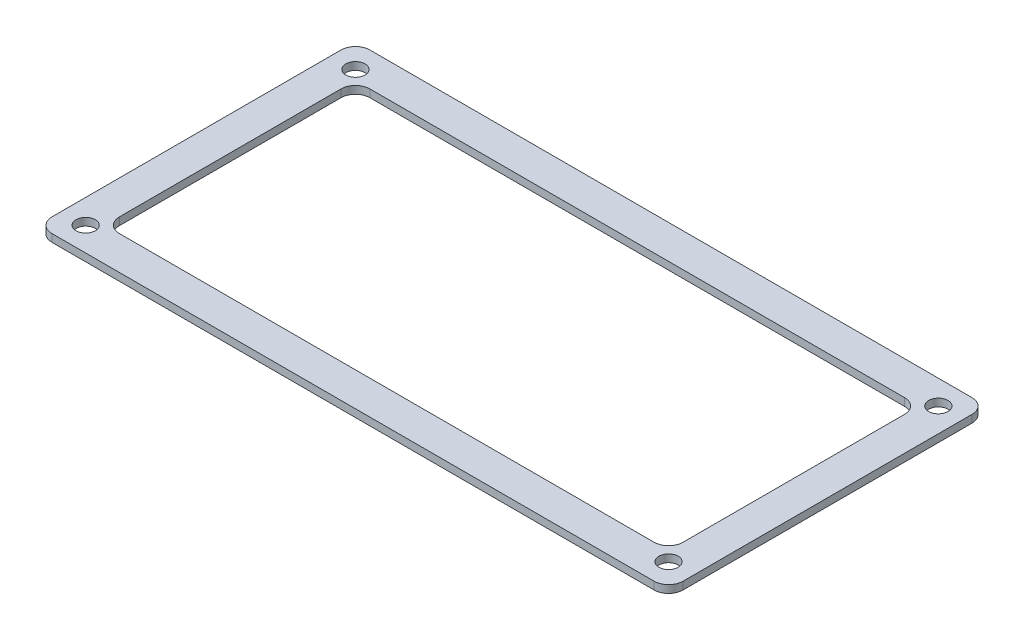
ISO-10303-21;
HEADER;
FILE_DESCRIPTION(('STEP AP214'),'2;1');
FILE_NAME('part.step','',(''),(''),'','','');
FILE_SCHEMA(('AUTOMOTIVE_DESIGN { 1 0 10303 214 1 1 1 1 }'));
ENDSEC;
DATA;
#1=APPLICATION_CONTEXT('core data for automotive mechanical design processes');
#2=APPLICATION_PROTOCOL_DEFINITION('international standard','automotive_design',2000,#1);
#3=PRODUCT_CONTEXT('',#1,'mechanical');
#4=PRODUCT('Part','Part','',(#3));
#5=PRODUCT_RELATED_PRODUCT_CATEGORY('part','',(#4));
#6=PRODUCT_DEFINITION_FORMATION('','',#4);
#7=PRODUCT_DEFINITION_CONTEXT('part definition',#1,'design');
#8=PRODUCT_DEFINITION('design','',#6,#7);
#9=PRODUCT_DEFINITION_SHAPE('','',#8);
#10=(LENGTH_UNIT() NAMED_UNIT(*) SI_UNIT(.MILLI.,.METRE.));
#11=(NAMED_UNIT(*) PLANE_ANGLE_UNIT() SI_UNIT($,.RADIAN.));
#12=(NAMED_UNIT(*) SI_UNIT($,.STERADIAN.) SOLID_ANGLE_UNIT());
#13=UNCERTAINTY_MEASURE_WITH_UNIT(LENGTH_MEASURE(1.E-05),#10,'distance_accuracy_value','');
#14=(GEOMETRIC_REPRESENTATION_CONTEXT(3) GLOBAL_UNCERTAINTY_ASSIGNED_CONTEXT((#13)) GLOBAL_UNIT_ASSIGNED_CONTEXT((#10,
#11,#12)) REPRESENTATION_CONTEXT('',''));
#15=CARTESIAN_POINT('',(0.,0.,0.));
#16=DIRECTION('',(0.,0.,1.));
#17=DIRECTION('',(1.,0.,0.));
#18=AXIS2_PLACEMENT_3D('',#15,#16,#17);
#19=CARTESIAN_POINT('',(-65.5,1.5875,-33.));
#20=DIRECTION('',(1.,0.,0.));
#21=DIRECTION('',(0.,0.,-1.));
#22=AXIS2_PLACEMENT_3D('',#19,#20,#21);
#23=PLANE('',#22);
#24=DIRECTION('',(0.,0.,1.));
#25=VECTOR('',#24,1.);
#26=CARTESIAN_POINT('',(-65.5,1.5875,-33.));
#27=LINE('',#26,#25);
#28=CARTESIAN_POINT('',(-65.5,1.5875,-30.));
#29=VERTEX_POINT('',#28);
#30=CARTESIAN_POINT('',(-65.5,1.5875,30.));
#31=VERTEX_POINT('',#30);
#32=EDGE_CURVE('E197',#29,#31,#27,.T.);
#33=ORIENTED_EDGE('',*,*,#32,.F.);
#34=DIRECTION('',(0.,-1.,0.));
#35=VECTOR('',#34,1.);
#36=CARTESIAN_POINT('',(-65.5,1.5875,-30.));
#37=LINE('',#36,#35);
#38=CARTESIAN_POINT('',(-65.5,0.,-30.));
#39=VERTEX_POINT('',#38);
#40=EDGE_CURVE('E166',#29,#39,#37,.T.);
#41=ORIENTED_EDGE('',*,*,#40,.T.);
#42=DIRECTION('',(0.,0.,1.));
#43=VECTOR('',#42,1.);
#44=CARTESIAN_POINT('',(-65.5,0.,-33.));
#45=LINE('',#44,#43);
#46=CARTESIAN_POINT('',(-65.5,0.,30.));
#47=VERTEX_POINT('',#46);
#48=EDGE_CURVE('E212',#39,#47,#45,.T.);
#49=ORIENTED_EDGE('',*,*,#48,.T.);
#50=DIRECTION('',(0.,-1.,0.));
#51=VECTOR('',#50,1.);
#52=CARTESIAN_POINT('',(-65.5,1.5875,30.));
#53=LINE('',#52,#51);
#54=EDGE_CURVE('E291',#47,#31,#53,.F.);
#55=ORIENTED_EDGE('',*,*,#54,.T.);
#56=EDGE_LOOP('',(#33,#41,#49,#55));
#57=FACE_BOUND('',#56,.T.);
#58=ADVANCED_FACE('F39',(#57),#23,.F.);
#59=CARTESIAN_POINT('',(-65.5,1.5875,33.));
#60=DIRECTION('',(0.,0.,-1.));
#61=DIRECTION('',(-1.,0.,0.));
#62=AXIS2_PLACEMENT_3D('',#59,#60,#61);
#63=PLANE('',#62);
#64=DIRECTION('',(1.,0.,0.));
#65=VECTOR('',#64,1.);
#66=CARTESIAN_POINT('',(-65.5,0.,33.));
#67=LINE('',#66,#65);
#68=CARTESIAN_POINT('',(-62.5,0.,33.));
#69=VERTEX_POINT('',#68);
#70=CARTESIAN_POINT('',(62.5,0.,33.));
#71=VERTEX_POINT('',#70);
#72=EDGE_CURVE('E216',#69,#71,#67,.T.);
#73=ORIENTED_EDGE('',*,*,#72,.T.);
#74=DIRECTION('',(0.,-1.,0.));
#75=VECTOR('',#74,1.);
#76=CARTESIAN_POINT('',(62.5,1.5875,33.));
#77=LINE('',#76,#75);
#78=CARTESIAN_POINT('',(62.5,1.5875,33.));
#79=VERTEX_POINT('',#78);
#80=EDGE_CURVE('E271',#71,#79,#77,.F.);
#81=ORIENTED_EDGE('',*,*,#80,.T.);
#82=DIRECTION('',(1.,0.,0.));
#83=VECTOR('',#82,1.);
#84=CARTESIAN_POINT('',(-65.5,1.5875,33.));
#85=LINE('',#84,#83);
#86=CARTESIAN_POINT('',(-62.5,1.5875,33.));
#87=VERTEX_POINT('',#86);
#88=EDGE_CURVE('E201',#87,#79,#85,.T.);
#89=ORIENTED_EDGE('',*,*,#88,.F.);
#90=DIRECTION('',(0.,-1.,0.));
#91=VECTOR('',#90,1.);
#92=CARTESIAN_POINT('',(-62.5,1.5875,33.));
#93=LINE('',#92,#91);
#94=EDGE_CURVE('E267',#87,#69,#93,.T.);
#95=ORIENTED_EDGE('',*,*,#94,.T.);
#96=EDGE_LOOP('',(#73,#81,#89,#95));
#97=FACE_BOUND('',#96,.T.);
#98=ADVANCED_FACE('F405',(#97),#63,.F.);
#99=CARTESIAN_POINT('',(65.5,1.5875,-33.));
#100=DIRECTION('',(-1.,0.,0.));
#101=DIRECTION('',(0.,0.,1.));
#102=AXIS2_PLACEMENT_3D('',#99,#100,#101);
#103=PLANE('',#102);
#104=DIRECTION('',(0.,0.,-1.));
#105=VECTOR('',#104,1.);
#106=CARTESIAN_POINT('',(65.5,1.5875,-33.));
#107=LINE('',#106,#105);
#108=CARTESIAN_POINT('',(65.5,1.5875,30.));
#109=VERTEX_POINT('',#108);
#110=CARTESIAN_POINT('',(65.5,1.5875,-30.));
#111=VERTEX_POINT('',#110);
#112=EDGE_CURVE('E206',#109,#111,#107,.T.);
#113=ORIENTED_EDGE('',*,*,#112,.F.);
#114=DIRECTION('',(0.,-1.,0.));
#115=VECTOR('',#114,1.);
#116=CARTESIAN_POINT('',(65.5,1.5875,30.));
#117=LINE('',#116,#115);
#118=CARTESIAN_POINT('',(65.5,0.,30.));
#119=VERTEX_POINT('',#118);
#120=EDGE_CURVE('E251',#109,#119,#117,.T.);
#121=ORIENTED_EDGE('',*,*,#120,.T.);
#122=DIRECTION('',(0.,0.,-1.));
#123=VECTOR('',#122,1.);
#124=CARTESIAN_POINT('',(65.5,0.,-33.));
#125=LINE('',#124,#123);
#126=CARTESIAN_POINT('',(65.5,0.,-30.));
#127=VERTEX_POINT('',#126);
#128=EDGE_CURVE('E221',#119,#127,#125,.T.);
#129=ORIENTED_EDGE('',*,*,#128,.T.);
#130=DIRECTION('',(0.,-1.,0.));
#131=VECTOR('',#130,1.);
#132=CARTESIAN_POINT('',(65.5,1.5875,-30.));
#133=LINE('',#132,#131);
#134=EDGE_CURVE('E248',#127,#111,#133,.F.);
#135=ORIENTED_EDGE('',*,*,#134,.T.);
#136=EDGE_LOOP('',(#113,#121,#129,#135));
#137=FACE_BOUND('',#136,.T.);
#138=ADVANCED_FACE('F411',(#137),#103,.F.);
#139=CARTESIAN_POINT('',(-65.5,1.5875,-33.));
#140=DIRECTION('',(0.,0.,1.));
#141=DIRECTION('',(1.,0.,0.));
#142=AXIS2_PLACEMENT_3D('',#139,#140,#141);
#143=PLANE('',#142);
#144=DIRECTION('',(-1.,0.,0.));
#145=VECTOR('',#144,1.);
#146=CARTESIAN_POINT('',(-65.5,1.5875,-33.));
#147=LINE('',#146,#145);
#148=CARTESIAN_POINT('',(62.5,1.5875,-33.));
#149=VERTEX_POINT('',#148);
#150=CARTESIAN_POINT('',(-62.5,1.5875,-33.));
#151=VERTEX_POINT('',#150);
#152=EDGE_CURVE('E209',#149,#151,#147,.T.);
#153=ORIENTED_EDGE('',*,*,#152,.F.);
#154=DIRECTION('',(0.,-1.,0.));
#155=VECTOR('',#154,1.);
#156=CARTESIAN_POINT('',(62.5,1.5875,-33.));
#157=LINE('',#156,#155);
#158=CARTESIAN_POINT('',(62.5,0.,-33.));
#159=VERTEX_POINT('',#158);
#160=EDGE_CURVE('E287',#149,#159,#157,.T.);
#161=ORIENTED_EDGE('',*,*,#160,.T.);
#162=DIRECTION('',(-1.,0.,0.));
#163=VECTOR('',#162,1.);
#164=CARTESIAN_POINT('',(-65.5,0.,-33.));
#165=LINE('',#164,#163);
#166=CARTESIAN_POINT('',(-62.5,0.,-33.));
#167=VERTEX_POINT('',#166);
#168=EDGE_CURVE('E202',#159,#167,#165,.T.);
#169=ORIENTED_EDGE('',*,*,#168,.T.);
#170=DIRECTION('',(0.,-1.,0.));
#171=VECTOR('',#170,1.);
#172=CARTESIAN_POINT('',(-62.5,1.5875,-33.));
#173=LINE('',#172,#171);
#174=EDGE_CURVE('E55',#167,#151,#173,.F.);
#175=ORIENTED_EDGE('',*,*,#174,.T.);
#176=EDGE_LOOP('',(#153,#161,#169,#175));
#177=FACE_BOUND('',#176,.T.);
#178=ADVANCED_FACE('F388',(#177),#143,.F.);
#179=CARTESIAN_POINT('',(0.,1.5875,0.));
#180=DIRECTION('',(0.,1.,0.));
#181=DIRECTION('',(0.,0.,1.));
#182=AXIS2_PLACEMENT_3D('',#179,#180,#181);
#183=PLANE('',#182);
#184=CARTESIAN_POINT('',(-60.5,1.5875,28.));
#185=DIRECTION('',(0.,1.,0.));
#186=DIRECTION('',(0.,0.,1.));
#187=AXIS2_PLACEMENT_3D('',#184,#185,#186);
#188=CIRCLE('',#187,2.);
#189=CARTESIAN_POINT('',(-60.5,1.5875,30.));
#190=VERTEX_POINT('',#189);
#191=EDGE_CURVE('E353',#190,#190,#188,.T.);
#192=ORIENTED_EDGE('',*,*,#191,.F.);
#193=EDGE_LOOP('',(#192));
#194=FACE_BOUND('',#193,.T.);
#195=CARTESIAN_POINT('',(60.5,1.5875,28.));
#196=DIRECTION('',(0.,1.,0.));
#197=DIRECTION('',(0.,0.,1.));
#198=AXIS2_PLACEMENT_3D('',#195,#196,#197);
#199=CIRCLE('',#198,2.);
#200=CARTESIAN_POINT('',(60.5,1.5875,30.));
#201=VERTEX_POINT('',#200);
#202=EDGE_CURVE('E361',#201,#201,#199,.T.);
#203=ORIENTED_EDGE('',*,*,#202,.F.);
#204=EDGE_LOOP('',(#203));
#205=FACE_BOUND('',#204,.T.);
#206=CARTESIAN_POINT('',(60.5,1.5875,-28.));
#207=DIRECTION('',(0.,1.,0.));
#208=DIRECTION('',(0.,0.,1.));
#209=AXIS2_PLACEMENT_3D('',#206,#207,#208);
#210=CIRCLE('',#209,2.);
#211=CARTESIAN_POINT('',(60.5,1.5875,-26.));
#212=VERTEX_POINT('',#211);
#213=EDGE_CURVE('E369',#212,#212,#210,.T.);
#214=ORIENTED_EDGE('',*,*,#213,.F.);
#215=EDGE_LOOP('',(#214));
#216=FACE_BOUND('',#215,.T.);
#217=CARTESIAN_POINT('',(-60.5,1.5875,-28.));
#218=DIRECTION('',(0.,1.,0.));
#219=DIRECTION('',(0.,0.,1.));
#220=AXIS2_PLACEMENT_3D('',#217,#218,#219);
#221=CIRCLE('',#220,2.);
#222=CARTESIAN_POINT('',(-60.5,1.5875,-26.));
#223=VERTEX_POINT('',#222);
#224=EDGE_CURVE('E337',#223,#223,#221,.T.);
#225=ORIENTED_EDGE('',*,*,#224,.F.);
#226=EDGE_LOOP('',(#225));
#227=FACE_BOUND('',#226,.T.);
#228=DIRECTION('',(0.,0.,1.));
#229=VECTOR('',#228,1.);
#230=CARTESIAN_POINT('',(-58.5,1.5875,26.));
#231=LINE('',#230,#229);
#232=CARTESIAN_POINT('',(-58.5,1.5875,-23.));
#233=VERTEX_POINT('',#232);
#234=CARTESIAN_POINT('',(-58.5,1.5875,23.));
#235=VERTEX_POINT('',#234);
#236=EDGE_CURVE('E193',#233,#235,#231,.T.);
#237=ORIENTED_EDGE('',*,*,#236,.F.);
#238=CARTESIAN_POINT('',(-55.5,1.5875,-23.));
#239=DIRECTION('',(0.,1.,0.));
#240=DIRECTION('',(0.,0.,1.));
#241=AXIS2_PLACEMENT_3D('',#238,#239,#240);
#242=CIRCLE('',#241,3.);
#243=CARTESIAN_POINT('',(-55.5,1.5875,-26.));
#244=VERTEX_POINT('',#243);
#245=EDGE_CURVE('E48',#233,#244,#242,.F.);
#246=ORIENTED_EDGE('',*,*,#245,.T.);
#247=DIRECTION('',(-1.,0.,0.));
#248=VECTOR('',#247,1.);
#249=CARTESIAN_POINT('',(-58.5,1.5875,-26.));
#250=LINE('',#249,#248);
#251=CARTESIAN_POINT('',(55.5,1.5875,-26.));
#252=VERTEX_POINT('',#251);
#253=EDGE_CURVE('E185',#252,#244,#250,.T.);
#254=ORIENTED_EDGE('',*,*,#253,.F.);
#255=CARTESIAN_POINT('',(55.5,1.5875,-23.));
#256=DIRECTION('',(0.,1.,0.));
#257=DIRECTION('',(0.,0.,1.));
#258=AXIS2_PLACEMENT_3D('',#255,#256,#257);
#259=CIRCLE('',#258,3.);
#260=CARTESIAN_POINT('',(58.5,1.5875,-23.));
#261=VERTEX_POINT('',#260);
#262=EDGE_CURVE('E183',#252,#261,#259,.F.);
#263=ORIENTED_EDGE('',*,*,#262,.T.);
#264=DIRECTION('',(0.,0.,-1.));
#265=VECTOR('',#264,1.);
#266=CARTESIAN_POINT('',(58.5,1.5875,26.));
#267=LINE('',#266,#265);
#268=CARTESIAN_POINT('',(58.5,1.5875,23.));
#269=VERTEX_POINT('',#268);
#270=EDGE_CURVE('E172',#269,#261,#267,.T.);
#271=ORIENTED_EDGE('',*,*,#270,.F.);
#272=CARTESIAN_POINT('',(55.5,1.5875,23.));
#273=DIRECTION('',(0.,1.,0.));
#274=DIRECTION('',(0.,0.,1.));
#275=AXIS2_PLACEMENT_3D('',#272,#273,#274);
#276=CIRCLE('',#275,3.);
#277=CARTESIAN_POINT('',(55.5,1.5875,26.));
#278=VERTEX_POINT('',#277);
#279=EDGE_CURVE('E154',#269,#278,#276,.F.);
#280=ORIENTED_EDGE('',*,*,#279,.T.);
#281=DIRECTION('',(1.,0.,0.));
#282=VECTOR('',#281,1.);
#283=CARTESIAN_POINT('',(-58.5,1.5875,26.));
#284=LINE('',#283,#282);
#285=CARTESIAN_POINT('',(-55.5,1.5875,26.));
#286=VERTEX_POINT('',#285);
#287=EDGE_CURVE('E186',#286,#278,#284,.T.);
#288=ORIENTED_EDGE('',*,*,#287,.F.);
#289=CARTESIAN_POINT('',(-55.5,1.5875,23.));
#290=DIRECTION('',(0.,1.,0.));
#291=DIRECTION('',(0.,0.,1.));
#292=AXIS2_PLACEMENT_3D('',#289,#290,#291);
#293=CIRCLE('',#292,3.);
#294=EDGE_CURVE('E299',#286,#235,#293,.F.);
#295=ORIENTED_EDGE('',*,*,#294,.T.);
#296=EDGE_LOOP('',(#237,#246,#254,#263,#271,#280,#288,#295));
#297=FACE_BOUND('',#296,.T.);
#298=ORIENTED_EDGE('',*,*,#88,.T.);
#299=CARTESIAN_POINT('',(62.5,1.5875,30.));
#300=DIRECTION('',(0.,1.,0.));
#301=DIRECTION('',(0.,0.,1.));
#302=AXIS2_PLACEMENT_3D('',#299,#300,#301);
#303=CIRCLE('',#302,3.);
#304=EDGE_CURVE('E282',#79,#109,#303,.T.);
#305=ORIENTED_EDGE('',*,*,#304,.T.);
#306=ORIENTED_EDGE('',*,*,#112,.T.);
#307=CARTESIAN_POINT('',(62.5,1.5875,-30.));
#308=DIRECTION('',(0.,1.,0.));
#309=DIRECTION('',(0.,0.,1.));
#310=AXIS2_PLACEMENT_3D('',#307,#308,#309);
#311=CIRCLE('',#310,3.);
#312=EDGE_CURVE('E62',#111,#149,#311,.T.);
#313=ORIENTED_EDGE('',*,*,#312,.T.);
#314=ORIENTED_EDGE('',*,*,#152,.T.);
#315=CARTESIAN_POINT('',(-62.5,1.5875,-30.));
#316=DIRECTION('',(0.,1.,0.));
#317=DIRECTION('',(0.,0.,1.));
#318=AXIS2_PLACEMENT_3D('',#315,#316,#317);
#319=CIRCLE('',#318,3.);
#320=EDGE_CURVE('E277',#151,#29,#319,.T.);
#321=ORIENTED_EDGE('',*,*,#320,.T.);
#322=ORIENTED_EDGE('',*,*,#32,.T.);
#323=CARTESIAN_POINT('',(-62.5,1.5875,30.));
#324=DIRECTION('',(0.,1.,0.));
#325=DIRECTION('',(0.,0.,1.));
#326=AXIS2_PLACEMENT_3D('',#323,#324,#325);
#327=CIRCLE('',#326,3.);
#328=EDGE_CURVE('E274',#31,#87,#327,.T.);
#329=ORIENTED_EDGE('',*,*,#328,.T.);
#330=EDGE_LOOP('',(#298,#305,#306,#313,#314,#321,#322,#329));
#331=FACE_BOUND('',#330,.T.);
#332=ADVANCED_FACE('F181',(#194,#205,#216,#227,#297,#331),#183,.T.);
#333=CARTESIAN_POINT('',(0.,0.,0.));
#334=DIRECTION('',(0.,1.,0.));
#335=DIRECTION('',(0.,0.,1.));
#336=AXIS2_PLACEMENT_3D('',#333,#334,#335);
#337=PLANE('',#336);
#338=CARTESIAN_POINT('',(-60.5,0.,28.));
#339=DIRECTION('',(0.,1.,0.));
#340=DIRECTION('',(0.,0.,1.));
#341=AXIS2_PLACEMENT_3D('',#338,#339,#340);
#342=CIRCLE('',#341,2.);
#343=CARTESIAN_POINT('',(-60.5,0.,30.));
#344=VERTEX_POINT('',#343);
#345=EDGE_CURVE('E357',#344,#344,#342,.T.);
#346=ORIENTED_EDGE('',*,*,#345,.T.);
#347=EDGE_LOOP('',(#346));
#348=FACE_BOUND('',#347,.T.);
#349=CARTESIAN_POINT('',(60.5,0.,28.));
#350=DIRECTION('',(0.,1.,0.));
#351=DIRECTION('',(0.,0.,1.));
#352=AXIS2_PLACEMENT_3D('',#349,#350,#351);
#353=CIRCLE('',#352,2.);
#354=CARTESIAN_POINT('',(60.5,0.,30.));
#355=VERTEX_POINT('',#354);
#356=EDGE_CURVE('E365',#355,#355,#353,.T.);
#357=ORIENTED_EDGE('',*,*,#356,.T.);
#358=EDGE_LOOP('',(#357));
#359=FACE_BOUND('',#358,.T.);
#360=CARTESIAN_POINT('',(60.5,0.,-28.));
#361=DIRECTION('',(0.,1.,0.));
#362=DIRECTION('',(0.,0.,1.));
#363=AXIS2_PLACEMENT_3D('',#360,#361,#362);
#364=CIRCLE('',#363,2.);
#365=CARTESIAN_POINT('',(60.5,0.,-26.));
#366=VERTEX_POINT('',#365);
#367=EDGE_CURVE('E351',#366,#366,#364,.T.);
#368=ORIENTED_EDGE('',*,*,#367,.T.);
#369=EDGE_LOOP('',(#368));
#370=FACE_BOUND('',#369,.T.);
#371=CARTESIAN_POINT('',(-60.5,0.,-28.));
#372=DIRECTION('',(0.,1.,0.));
#373=DIRECTION('',(0.,0.,1.));
#374=AXIS2_PLACEMENT_3D('',#371,#372,#373);
#375=CIRCLE('',#374,2.);
#376=CARTESIAN_POINT('',(-60.5,0.,-26.));
#377=VERTEX_POINT('',#376);
#378=EDGE_CURVE('E344',#377,#377,#375,.T.);
#379=ORIENTED_EDGE('',*,*,#378,.T.);
#380=EDGE_LOOP('',(#379));
#381=FACE_BOUND('',#380,.T.);
#382=DIRECTION('',(0.,0.,-1.));
#383=VECTOR('',#382,1.);
#384=CARTESIAN_POINT('',(58.5,0.,26.));
#385=LINE('',#384,#383);
#386=CARTESIAN_POINT('',(58.5,0.,23.));
#387=VERTEX_POINT('',#386);
#388=CARTESIAN_POINT('',(58.5,0.,-23.));
#389=VERTEX_POINT('',#388);
#390=EDGE_CURVE('E175',#387,#389,#385,.T.);
#391=ORIENTED_EDGE('',*,*,#390,.T.);
#392=CARTESIAN_POINT('',(55.5,0.,-23.));
#393=DIRECTION('',(0.,1.,0.));
#394=DIRECTION('',(0.,0.,1.));
#395=AXIS2_PLACEMENT_3D('',#392,#393,#394);
#396=CIRCLE('',#395,3.);
#397=CARTESIAN_POINT('',(55.5,0.,-26.));
#398=VERTEX_POINT('',#397);
#399=EDGE_CURVE('E307',#389,#398,#396,.T.);
#400=ORIENTED_EDGE('',*,*,#399,.T.);
#401=DIRECTION('',(-1.,0.,0.));
#402=VECTOR('',#401,1.);
#403=CARTESIAN_POINT('',(-58.5,0.,-26.));
#404=LINE('',#403,#402);
#405=CARTESIAN_POINT('',(-55.5,0.,-26.));
#406=VERTEX_POINT('',#405);
#407=EDGE_CURVE('E217',#398,#406,#404,.T.);
#408=ORIENTED_EDGE('',*,*,#407,.T.);
#409=CARTESIAN_POINT('',(-55.5,0.,-23.));
#410=DIRECTION('',(0.,1.,0.));
#411=DIRECTION('',(0.,0.,1.));
#412=AXIS2_PLACEMENT_3D('',#409,#410,#411);
#413=CIRCLE('',#412,3.);
#414=CARTESIAN_POINT('',(-58.5,0.,-23.));
#415=VERTEX_POINT('',#414);
#416=EDGE_CURVE('E11',#406,#415,#413,.T.);
#417=ORIENTED_EDGE('',*,*,#416,.T.);
#418=DIRECTION('',(0.,0.,1.));
#419=VECTOR('',#418,1.);
#420=CARTESIAN_POINT('',(-58.5,0.,26.));
#421=LINE('',#420,#419);
#422=CARTESIAN_POINT('',(-58.5,0.,23.));
#423=VERTEX_POINT('',#422);
#424=EDGE_CURVE('E191',#415,#423,#421,.T.);
#425=ORIENTED_EDGE('',*,*,#424,.T.);
#426=CARTESIAN_POINT('',(-55.5,0.,23.));
#427=DIRECTION('',(0.,1.,0.));
#428=DIRECTION('',(0.,0.,1.));
#429=AXIS2_PLACEMENT_3D('',#426,#427,#428);
#430=CIRCLE('',#429,3.);
#431=CARTESIAN_POINT('',(-55.5,0.,26.));
#432=VERTEX_POINT('',#431);
#433=EDGE_CURVE('E302',#423,#432,#430,.T.);
#434=ORIENTED_EDGE('',*,*,#433,.T.);
#435=DIRECTION('',(1.,0.,0.));
#436=VECTOR('',#435,1.);
#437=CARTESIAN_POINT('',(-58.5,0.,26.));
#438=LINE('',#437,#436);
#439=CARTESIAN_POINT('',(55.5,0.,26.));
#440=VERTEX_POINT('',#439);
#441=EDGE_CURVE('E331',#432,#440,#438,.T.);
#442=ORIENTED_EDGE('',*,*,#441,.T.);
#443=CARTESIAN_POINT('',(55.5,0.,23.));
#444=DIRECTION('',(0.,1.,0.));
#445=DIRECTION('',(0.,0.,1.));
#446=AXIS2_PLACEMENT_3D('',#443,#444,#445);
#447=CIRCLE('',#446,3.);
#448=EDGE_CURVE('E165',#440,#387,#447,.T.);
#449=ORIENTED_EDGE('',*,*,#448,.T.);
#450=EDGE_LOOP('',(#391,#400,#408,#417,#425,#434,#442,#449));
#451=FACE_BOUND('',#450,.T.);
#452=ORIENTED_EDGE('',*,*,#128,.F.);
#453=CARTESIAN_POINT('',(62.5,0.,30.));
#454=DIRECTION('',(0.,1.,0.));
#455=DIRECTION('',(0.,0.,1.));
#456=AXIS2_PLACEMENT_3D('',#453,#454,#455);
#457=CIRCLE('',#456,3.);
#458=EDGE_CURVE('E264',#119,#71,#457,.F.);
#459=ORIENTED_EDGE('',*,*,#458,.T.);
#460=ORIENTED_EDGE('',*,*,#72,.F.);
#461=CARTESIAN_POINT('',(-62.5,0.,30.));
#462=DIRECTION('',(0.,1.,0.));
#463=DIRECTION('',(0.,0.,1.));
#464=AXIS2_PLACEMENT_3D('',#461,#462,#463);
#465=CIRCLE('',#464,3.);
#466=EDGE_CURVE('E255',#69,#47,#465,.F.);
#467=ORIENTED_EDGE('',*,*,#466,.T.);
#468=ORIENTED_EDGE('',*,*,#48,.F.);
#469=CARTESIAN_POINT('',(-62.5,0.,-30.));
#470=DIRECTION('',(0.,1.,0.));
#471=DIRECTION('',(0.,0.,1.));
#472=AXIS2_PLACEMENT_3D('',#469,#470,#471);
#473=CIRCLE('',#472,3.);
#474=EDGE_CURVE('E258',#39,#167,#473,.F.);
#475=ORIENTED_EDGE('',*,*,#474,.T.);
#476=ORIENTED_EDGE('',*,*,#168,.F.);
#477=CARTESIAN_POINT('',(62.5,0.,-30.));
#478=DIRECTION('',(0.,1.,0.));
#479=DIRECTION('',(0.,0.,1.));
#480=AXIS2_PLACEMENT_3D('',#477,#478,#479);
#481=CIRCLE('',#480,3.);
#482=EDGE_CURVE('E261',#159,#127,#481,.F.);
#483=ORIENTED_EDGE('',*,*,#482,.T.);
#484=EDGE_LOOP('',(#452,#459,#460,#467,#468,#475,#476,#483));
#485=FACE_BOUND('',#484,.T.);
#486=ADVANCED_FACE('F324',(#348,#359,#370,#381,#451,#485),#337,.F.);
#487=CARTESIAN_POINT('',(-58.5,0.,26.));
#488=DIRECTION('',(-1.,0.,0.));
#489=DIRECTION('',(0.,0.,1.));
#490=AXIS2_PLACEMENT_3D('',#487,#488,#489);
#491=PLANE('',#490);
#492=ORIENTED_EDGE('',*,*,#236,.T.);
#493=DIRECTION('',(0.,1.,0.));
#494=VECTOR('',#493,1.);
#495=CARTESIAN_POINT('',(-58.5,0.,23.));
#496=LINE('',#495,#494);
#497=EDGE_CURVE('E238',#235,#423,#496,.F.);
#498=ORIENTED_EDGE('',*,*,#497,.T.);
#499=ORIENTED_EDGE('',*,*,#424,.F.);
#500=DIRECTION('',(0.,1.,0.));
#501=VECTOR('',#500,1.);
#502=CARTESIAN_POINT('',(-58.5,1.5875,-23.));
#503=LINE('',#502,#501);
#504=EDGE_CURVE('E234',#415,#233,#503,.T.);
#505=ORIENTED_EDGE('',*,*,#504,.T.);
#506=EDGE_LOOP('',(#492,#498,#499,#505));
#507=FACE_BOUND('',#506,.T.);
#508=ADVANCED_FACE('F328',(#507),#491,.F.);
#509=CARTESIAN_POINT('',(-58.5,0.,-26.));
#510=DIRECTION('',(0.,0.,-1.));
#511=DIRECTION('',(-1.,0.,0.));
#512=AXIS2_PLACEMENT_3D('',#509,#510,#511);
#513=PLANE('',#512);
#514=ORIENTED_EDGE('',*,*,#407,.F.);
#515=DIRECTION('',(0.,1.,0.));
#516=VECTOR('',#515,1.);
#517=CARTESIAN_POINT('',(55.5,1.5875,-26.));
#518=LINE('',#517,#516);
#519=EDGE_CURVE('E244',#398,#252,#518,.T.);
#520=ORIENTED_EDGE('',*,*,#519,.T.);
#521=ORIENTED_EDGE('',*,*,#253,.T.);
#522=DIRECTION('',(0.,1.,0.));
#523=VECTOR('',#522,1.);
#524=CARTESIAN_POINT('',(-55.5,0.,-26.));
#525=LINE('',#524,#523);
#526=EDGE_CURVE('E241',#244,#406,#525,.F.);
#527=ORIENTED_EDGE('',*,*,#526,.T.);
#528=EDGE_LOOP('',(#514,#520,#521,#527));
#529=FACE_BOUND('',#528,.T.);
#530=ADVANCED_FACE('F316',(#529),#513,.F.);
#531=CARTESIAN_POINT('',(58.5,0.,26.));
#532=DIRECTION('',(1.,0.,0.));
#533=DIRECTION('',(0.,0.,-1.));
#534=AXIS2_PLACEMENT_3D('',#531,#532,#533);
#535=PLANE('',#534);
#536=ORIENTED_EDGE('',*,*,#390,.F.);
#537=DIRECTION('',(0.,1.,0.));
#538=VECTOR('',#537,1.);
#539=CARTESIAN_POINT('',(58.5,1.5875,23.));
#540=LINE('',#539,#538);
#541=EDGE_CURVE('E158',#387,#269,#540,.T.);
#542=ORIENTED_EDGE('',*,*,#541,.T.);
#543=ORIENTED_EDGE('',*,*,#270,.T.);
#544=DIRECTION('',(0.,1.,0.));
#545=VECTOR('',#544,1.);
#546=CARTESIAN_POINT('',(58.5,0.,-23.));
#547=LINE('',#546,#545);
#548=EDGE_CURVE('E178',#261,#389,#547,.F.);
#549=ORIENTED_EDGE('',*,*,#548,.T.);
#550=EDGE_LOOP('',(#536,#542,#543,#549));
#551=FACE_BOUND('',#550,.T.);
#552=ADVANCED_FACE('F171',(#551),#535,.F.);
#553=CARTESIAN_POINT('',(-58.5,0.,26.));
#554=DIRECTION('',(0.,0.,1.));
#555=DIRECTION('',(1.,0.,0.));
#556=AXIS2_PLACEMENT_3D('',#553,#554,#555);
#557=PLANE('',#556);
#558=ORIENTED_EDGE('',*,*,#287,.T.);
#559=DIRECTION('',(0.,1.,0.));
#560=VECTOR('',#559,1.);
#561=CARTESIAN_POINT('',(55.5,0.,26.));
#562=LINE('',#561,#560);
#563=EDGE_CURVE('E159',#278,#440,#562,.F.);
#564=ORIENTED_EDGE('',*,*,#563,.T.);
#565=ORIENTED_EDGE('',*,*,#441,.F.);
#566=DIRECTION('',(0.,1.,0.));
#567=VECTOR('',#566,1.);
#568=CARTESIAN_POINT('',(-55.5,1.5875,26.));
#569=LINE('',#568,#567);
#570=EDGE_CURVE('E177',#432,#286,#569,.T.);
#571=ORIENTED_EDGE('',*,*,#570,.T.);
#572=EDGE_LOOP('',(#558,#564,#565,#571));
#573=FACE_BOUND('',#572,.T.);
#574=ADVANCED_FACE('F394',(#573),#557,.F.);
#575=CARTESIAN_POINT('',(-60.5,0.,-28.));
#576=DIRECTION('',(0.,1.,0.));
#577=DIRECTION('',(0.,0.,1.));
#578=AXIS2_PLACEMENT_3D('',#575,#576,#577);
#579=CYLINDRICAL_SURFACE('',#578,2.);
#580=ORIENTED_EDGE('',*,*,#378,.F.);
#581=EDGE_LOOP('',(#580));
#582=FACE_BOUND('',#581,.T.);
#583=ORIENTED_EDGE('',*,*,#224,.T.);
#584=EDGE_LOOP('',(#583));
#585=FACE_BOUND('',#584,.T.);
#586=ADVANCED_FACE('F382',(#582,#585),#579,.F.);
#587=CARTESIAN_POINT('',(60.5,0.,-28.));
#588=DIRECTION('',(0.,1.,0.));
#589=DIRECTION('',(0.,0.,1.));
#590=AXIS2_PLACEMENT_3D('',#587,#588,#589);
#591=CYLINDRICAL_SURFACE('',#590,2.);
#592=ORIENTED_EDGE('',*,*,#367,.F.);
#593=EDGE_LOOP('',(#592));
#594=FACE_BOUND('',#593,.T.);
#595=ORIENTED_EDGE('',*,*,#213,.T.);
#596=EDGE_LOOP('',(#595));
#597=FACE_BOUND('',#596,.T.);
#598=ADVANCED_FACE('F378',(#594,#597),#591,.F.);
#599=CARTESIAN_POINT('',(60.5,0.,28.));
#600=DIRECTION('',(0.,1.,0.));
#601=DIRECTION('',(0.,0.,1.));
#602=AXIS2_PLACEMENT_3D('',#599,#600,#601);
#603=CYLINDRICAL_SURFACE('',#602,2.);
#604=ORIENTED_EDGE('',*,*,#356,.F.);
#605=EDGE_LOOP('',(#604));
#606=FACE_BOUND('',#605,.T.);
#607=ORIENTED_EDGE('',*,*,#202,.T.);
#608=EDGE_LOOP('',(#607));
#609=FACE_BOUND('',#608,.T.);
#610=ADVANCED_FACE('F381',(#606,#609),#603,.F.);
#611=CARTESIAN_POINT('',(-60.5,0.,28.));
#612=DIRECTION('',(0.,1.,0.));
#613=DIRECTION('',(0.,0.,1.));
#614=AXIS2_PLACEMENT_3D('',#611,#612,#613);
#615=CYLINDRICAL_SURFACE('',#614,2.);
#616=ORIENTED_EDGE('',*,*,#345,.F.);
#617=EDGE_LOOP('',(#616));
#618=FACE_BOUND('',#617,.T.);
#619=ORIENTED_EDGE('',*,*,#191,.T.);
#620=EDGE_LOOP('',(#619));
#621=FACE_BOUND('',#620,.T.);
#622=ADVANCED_FACE('F420',(#618,#621),#615,.F.);
#623=CARTESIAN_POINT('',(55.5,0.,23.));
#624=DIRECTION('',(0.,-1.,0.));
#625=DIRECTION('',(0.,0.,-1.));
#626=AXIS2_PLACEMENT_3D('',#623,#624,#625);
#627=CYLINDRICAL_SURFACE('',#626,3.);
#628=ORIENTED_EDGE('',*,*,#448,.F.);
#629=ORIENTED_EDGE('',*,*,#563,.F.);
#630=ORIENTED_EDGE('',*,*,#279,.F.);
#631=ORIENTED_EDGE('',*,*,#541,.F.);
#632=EDGE_LOOP('',(#628,#629,#630,#631));
#633=FACE_BOUND('',#632,.T.);
#634=ADVANCED_FACE('F157',(#633),#627,.F.);
#635=CARTESIAN_POINT('',(-55.5,0.,23.));
#636=DIRECTION('',(0.,-1.,0.));
#637=DIRECTION('',(0.,0.,-1.));
#638=AXIS2_PLACEMENT_3D('',#635,#636,#637);
#639=CYLINDRICAL_SURFACE('',#638,3.);
#640=ORIENTED_EDGE('',*,*,#433,.F.);
#641=ORIENTED_EDGE('',*,*,#497,.F.);
#642=ORIENTED_EDGE('',*,*,#294,.F.);
#643=ORIENTED_EDGE('',*,*,#570,.F.);
#644=EDGE_LOOP('',(#640,#641,#642,#643));
#645=FACE_BOUND('',#644,.T.);
#646=ADVANCED_FACE('F419',(#645),#639,.F.);
#647=CARTESIAN_POINT('',(55.5,0.,-23.));
#648=DIRECTION('',(0.,-1.,0.));
#649=DIRECTION('',(0.,0.,-1.));
#650=AXIS2_PLACEMENT_3D('',#647,#648,#649);
#651=CYLINDRICAL_SURFACE('',#650,3.);
#652=ORIENTED_EDGE('',*,*,#399,.F.);
#653=ORIENTED_EDGE('',*,*,#548,.F.);
#654=ORIENTED_EDGE('',*,*,#262,.F.);
#655=ORIENTED_EDGE('',*,*,#519,.F.);
#656=EDGE_LOOP('',(#652,#653,#654,#655));
#657=FACE_BOUND('',#656,.T.);
#658=ADVANCED_FACE('F423',(#657),#651,.F.);
#659=CARTESIAN_POINT('',(-55.5,0.,-23.));
#660=DIRECTION('',(0.,-1.,0.));
#661=DIRECTION('',(0.,0.,-1.));
#662=AXIS2_PLACEMENT_3D('',#659,#660,#661);
#663=CYLINDRICAL_SURFACE('',#662,3.);
#664=ORIENTED_EDGE('',*,*,#416,.F.);
#665=ORIENTED_EDGE('',*,*,#526,.F.);
#666=ORIENTED_EDGE('',*,*,#245,.F.);
#667=ORIENTED_EDGE('',*,*,#504,.F.);
#668=EDGE_LOOP('',(#664,#665,#666,#667));
#669=FACE_BOUND('',#668,.T.);
#670=ADVANCED_FACE('F320',(#669),#663,.F.);
#671=CARTESIAN_POINT('',(62.5,1.5875,30.));
#672=DIRECTION('',(0.,-1.,0.));
#673=DIRECTION('',(0.,0.,-1.));
#674=AXIS2_PLACEMENT_3D('',#671,#672,#673);
#675=CYLINDRICAL_SURFACE('',#674,3.);
#676=ORIENTED_EDGE('',*,*,#304,.F.);
#677=ORIENTED_EDGE('',*,*,#80,.F.);
#678=ORIENTED_EDGE('',*,*,#458,.F.);
#679=ORIENTED_EDGE('',*,*,#120,.F.);
#680=EDGE_LOOP('',(#676,#677,#678,#679));
#681=FACE_BOUND('',#680,.T.);
#682=ADVANCED_FACE('F430',(#681),#675,.T.);
#683=CARTESIAN_POINT('',(62.5,1.5875,-30.));
#684=DIRECTION('',(0.,-1.,0.));
#685=DIRECTION('',(0.,0.,-1.));
#686=AXIS2_PLACEMENT_3D('',#683,#684,#685);
#687=CYLINDRICAL_SURFACE('',#686,3.);
#688=ORIENTED_EDGE('',*,*,#312,.F.);
#689=ORIENTED_EDGE('',*,*,#134,.F.);
#690=ORIENTED_EDGE('',*,*,#482,.F.);
#691=ORIENTED_EDGE('',*,*,#160,.F.);
#692=EDGE_LOOP('',(#688,#689,#690,#691));
#693=FACE_BOUND('',#692,.T.);
#694=ADVANCED_FACE('F433',(#693),#687,.T.);
#695=CARTESIAN_POINT('',(-62.5,1.5875,-30.));
#696=DIRECTION('',(0.,-1.,0.));
#697=DIRECTION('',(0.,0.,-1.));
#698=AXIS2_PLACEMENT_3D('',#695,#696,#697);
#699=CYLINDRICAL_SURFACE('',#698,3.);
#700=ORIENTED_EDGE('',*,*,#320,.F.);
#701=ORIENTED_EDGE('',*,*,#174,.F.);
#702=ORIENTED_EDGE('',*,*,#474,.F.);
#703=ORIENTED_EDGE('',*,*,#40,.F.);
#704=EDGE_LOOP('',(#700,#701,#702,#703));
#705=FACE_BOUND('',#704,.T.);
#706=ADVANCED_FACE('F436',(#705),#699,.T.);
#707=CARTESIAN_POINT('',(-62.5,1.5875,30.));
#708=DIRECTION('',(0.,-1.,0.));
#709=DIRECTION('',(0.,0.,-1.));
#710=AXIS2_PLACEMENT_3D('',#707,#708,#709);
#711=CYLINDRICAL_SURFACE('',#710,3.);
#712=ORIENTED_EDGE('',*,*,#328,.F.);
#713=ORIENTED_EDGE('',*,*,#54,.F.);
#714=ORIENTED_EDGE('',*,*,#466,.F.);
#715=ORIENTED_EDGE('',*,*,#94,.F.);
#716=EDGE_LOOP('',(#712,#713,#714,#715));
#717=FACE_BOUND('',#716,.T.);
#718=ADVANCED_FACE('F41',(#717),#711,.T.);
#719=CLOSED_SHELL('',(#58,#98,#138,#178,#332,#486,#508,#530,#552,#574,#586,#598,#610,#622,#634,
#646,#658,#670,#682,#694,#706,#718));
#720=MANIFOLD_SOLID_BREP('B2',#719);
#721=ADVANCED_BREP_SHAPE_REPRESENTATION('',(#18,#720),#14);
#722=SHAPE_DEFINITION_REPRESENTATION(#9,#721);
ENDSEC;
END-ISO-10303-21;
